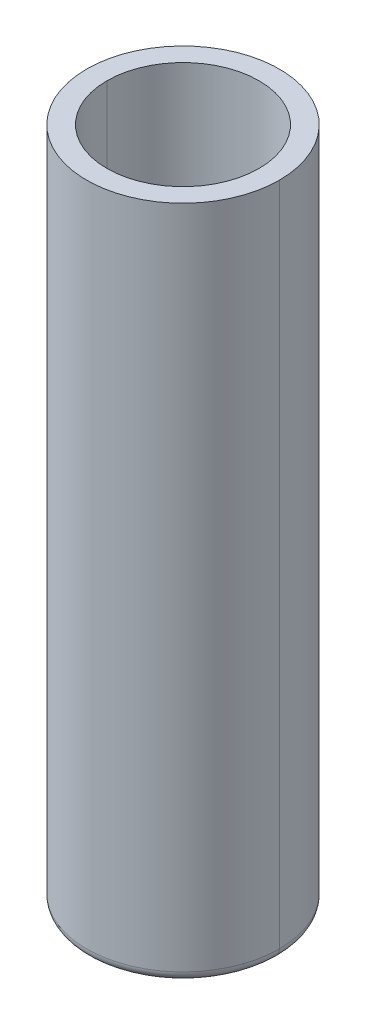
ISO-10303-21;
HEADER;
FILE_DESCRIPTION(('STEP AP214'),'2;1');
FILE_NAME('part.step','',(''),(''),'','','');
FILE_SCHEMA(('AUTOMOTIVE_DESIGN { 1 0 10303 214 1 1 1 1 }'));
ENDSEC;
DATA;
#1=APPLICATION_CONTEXT('core data for automotive mechanical design processes');
#2=APPLICATION_PROTOCOL_DEFINITION('international standard','automotive_design',2000,#1);
#3=PRODUCT_CONTEXT('',#1,'mechanical');
#4=PRODUCT('Part','Part','',(#3));
#5=PRODUCT_RELATED_PRODUCT_CATEGORY('part','',(#4));
#6=PRODUCT_DEFINITION_FORMATION('','',#4);
#7=PRODUCT_DEFINITION_CONTEXT('part definition',#1,'design');
#8=PRODUCT_DEFINITION('design','',#6,#7);
#9=PRODUCT_DEFINITION_SHAPE('','',#8);
#10=(LENGTH_UNIT() NAMED_UNIT(*) SI_UNIT(.MILLI.,.METRE.));
#11=(NAMED_UNIT(*) PLANE_ANGLE_UNIT() SI_UNIT($,.RADIAN.));
#12=(NAMED_UNIT(*) SI_UNIT($,.STERADIAN.) SOLID_ANGLE_UNIT());
#13=UNCERTAINTY_MEASURE_WITH_UNIT(LENGTH_MEASURE(1.E-05),#10,'distance_accuracy_value','');
#14=(GEOMETRIC_REPRESENTATION_CONTEXT(3) GLOBAL_UNCERTAINTY_ASSIGNED_CONTEXT((#13)) GLOBAL_UNIT_ASSIGNED_CONTEXT((#10,
#11,#12)) REPRESENTATION_CONTEXT('',''));
#15=CARTESIAN_POINT('',(0.,0.,0.));
#16=DIRECTION('',(0.,0.,1.));
#17=DIRECTION('',(1.,0.,0.));
#18=AXIS2_PLACEMENT_3D('',#15,#16,#17);
#19=CARTESIAN_POINT('',(0.,2.,0.));
#20=DIRECTION('',(0.,1.,0.));
#21=DIRECTION('',(1.,0.,0.));
#22=AXIS2_PLACEMENT_3D('',#19,#20,#21);
#23=PLANE('',#22);
#24=CARTESIAN_POINT('',(0.,2.,0.));
#25=DIRECTION('',(0.,1.,0.));
#26=DIRECTION('',(1.,0.,0.));
#27=AXIS2_PLACEMENT_3D('',#24,#25,#26);
#28=CIRCLE('',#27,2.25);
#29=CARTESIAN_POINT('',(-2.25,2.,0.));
#30=VERTEX_POINT('',#29);
#31=CARTESIAN_POINT('',(2.25,2.,0.));
#32=VERTEX_POINT('',#31);
#33=EDGE_CURVE('E29',#30,#32,#28,.T.);
#34=ORIENTED_EDGE('',*,*,#33,.T.);
#35=CARTESIAN_POINT('',(0.,2.,0.));
#36=DIRECTION('',(0.,1.,0.));
#37=DIRECTION('',(1.,0.,0.));
#38=AXIS2_PLACEMENT_3D('',#35,#36,#37);
#39=CIRCLE('',#38,2.25);
#40=EDGE_CURVE('E11',#32,#30,#39,.T.);
#41=ORIENTED_EDGE('',*,*,#40,.T.);
#42=EDGE_LOOP('',(#34,#41));
#43=FACE_BOUND('',#42,.T.);
#44=ADVANCED_FACE('F16',(#43),#23,.T.);
#45=CARTESIAN_POINT('',(0.,11.,0.));
#46=DIRECTION('',(0.,1.,0.));
#47=DIRECTION('',(-1.,0.,0.));
#48=AXIS2_PLACEMENT_3D('',#45,#46,#47);
#49=CYLINDRICAL_SURFACE('',#48,2.25);
#50=DIRECTION('',(0.,-1.,0.));
#51=VECTOR('',#50,1.);
#52=CARTESIAN_POINT('',(2.25,11.,0.));
#53=LINE('',#52,#51);
#54=CARTESIAN_POINT('',(2.25,20.,0.));
#55=VERTEX_POINT('',#54);
#56=EDGE_CURVE('E145',#55,#32,#53,.T.);
#57=ORIENTED_EDGE('',*,*,#56,.F.);
#58=CARTESIAN_POINT('',(0.,20.,0.));
#59=DIRECTION('',(0.,1.,0.));
#60=DIRECTION('',(1.,0.,0.));
#61=AXIS2_PLACEMENT_3D('',#58,#59,#60);
#62=CIRCLE('',#61,2.25);
#63=CARTESIAN_POINT('',(-2.25,20.,0.));
#64=VERTEX_POINT('',#63);
#65=EDGE_CURVE('E146',#55,#64,#62,.T.);
#66=ORIENTED_EDGE('',*,*,#65,.T.);
#67=DIRECTION('',(0.,-1.,0.));
#68=VECTOR('',#67,1.);
#69=CARTESIAN_POINT('',(-2.25,11.,0.));
#70=LINE('',#69,#68);
#71=EDGE_CURVE('E143',#64,#30,#70,.T.);
#72=ORIENTED_EDGE('',*,*,#71,.T.);
#73=ORIENTED_EDGE('',*,*,#40,.F.);
#74=EDGE_LOOP('',(#57,#66,#72,#73));
#75=FACE_BOUND('',#74,.T.);
#76=ADVANCED_FACE('F174',(#75),#49,.F.);
#77=CARTESIAN_POINT('',(0.,11.,0.));
#78=DIRECTION('',(0.,1.,0.));
#79=DIRECTION('',(-1.,0.,0.));
#80=AXIS2_PLACEMENT_3D('',#77,#78,#79);
#81=CYLINDRICAL_SURFACE('',#80,2.25);
#82=ORIENTED_EDGE('',*,*,#71,.F.);
#83=CARTESIAN_POINT('',(0.,20.,0.));
#84=DIRECTION('',(0.,1.,0.));
#85=DIRECTION('',(1.,0.,0.));
#86=AXIS2_PLACEMENT_3D('',#83,#84,#85);
#87=CIRCLE('',#86,2.25);
#88=EDGE_CURVE('E137',#64,#55,#87,.T.);
#89=ORIENTED_EDGE('',*,*,#88,.T.);
#90=ORIENTED_EDGE('',*,*,#56,.T.);
#91=ORIENTED_EDGE('',*,*,#33,.F.);
#92=EDGE_LOOP('',(#82,#89,#90,#91));
#93=FACE_BOUND('',#92,.T.);
#94=ADVANCED_FACE('F177',(#93),#81,.F.);
#95=CARTESIAN_POINT('',(0.,20.,0.));
#96=DIRECTION('',(0.,1.,0.));
#97=DIRECTION('',(1.,0.,0.));
#98=AXIS2_PLACEMENT_3D('',#95,#96,#97);
#99=PLANE('',#98);
#100=ORIENTED_EDGE('',*,*,#88,.F.);
#101=ORIENTED_EDGE('',*,*,#65,.F.);
#102=EDGE_LOOP('',(#100,#101));
#103=FACE_BOUND('',#102,.T.);
#104=CARTESIAN_POINT('',(0.,20.,0.));
#105=DIRECTION('',(0.,1.,0.));
#106=DIRECTION('',(1.,0.,0.));
#107=AXIS2_PLACEMENT_3D('',#104,#105,#106);
#108=CIRCLE('',#107,2.85);
#109=CARTESIAN_POINT('',(-2.85,20.,0.));
#110=VERTEX_POINT('',#109);
#111=CARTESIAN_POINT('',(2.85,20.,0.));
#112=VERTEX_POINT('',#111);
#113=EDGE_CURVE('E231',#110,#112,#108,.T.);
#114=ORIENTED_EDGE('',*,*,#113,.T.);
#115=CARTESIAN_POINT('',(0.,20.,0.));
#116=DIRECTION('',(0.,1.,0.));
#117=DIRECTION('',(1.,0.,0.));
#118=AXIS2_PLACEMENT_3D('',#115,#116,#117);
#119=CIRCLE('',#118,2.85);
#120=EDGE_CURVE('E217',#112,#110,#119,.T.);
#121=ORIENTED_EDGE('',*,*,#120,.T.);
#122=EDGE_LOOP('',(#114,#121));
#123=FACE_BOUND('',#122,.T.);
#124=ADVANCED_FACE('F165',(#103,#123),#99,.T.);
#125=CARTESIAN_POINT('',(0.,1.,0.));
#126=DIRECTION('',(0.,1.,0.));
#127=DIRECTION('',(0.127966679283979,0.,-0.991778467699834));
#128=AXIS2_PLACEMENT_3D('',#125,#126,#127);
#129=TOROIDAL_SURFACE('',#128,2.08591509775,1.);
#130=CARTESIAN_POINT('',(-1.00004096922,1.,-1.83056271537));
#131=DIRECTION('',(-0.877582561890372,0.,0.479425538604204));
#132=DIRECTION('',(0.479425538604204,0.,0.877582561890372));
#133=AXIS2_PLACEMENT_3D('',#130,#131,#132);
#134=CIRCLE('',#133,1.);
#135=CARTESIAN_POINT('',(-1.00004078601,0.,-1.83056281546));
#136=VERTEX_POINT('',#135);
#137=CARTESIAN_POINT('',(-0.646836361433,0.323807125575,-1.18402601756));
#138=VERTEX_POINT('',#137);
#139=EDGE_CURVE('E134',#136,#138,#134,.T.);
#140=ORIENTED_EDGE('',*,*,#139,.T.);
#141=CARTESIAN_POINT('',(0.,0.323807125575,0.));
#142=DIRECTION('',(0.,1.,0.));
#143=DIRECTION('',(1.,0.,0.));
#144=AXIS2_PLACEMENT_3D('',#141,#142,#143);
#145=CIRCLE('',#144,1.3491904568);
#146=CARTESIAN_POINT('',(0.646836361433,0.323807125575,1.18402601756));
#147=VERTEX_POINT('',#146);
#148=EDGE_CURVE('E249',#138,#147,#145,.T.);
#149=ORIENTED_EDGE('',*,*,#148,.T.);
#150=CARTESIAN_POINT('',(1.00004096922,1.,1.83056271537));
#151=DIRECTION('',(0.877582561890372,0.,-0.479425538604204));
#152=DIRECTION('',(0.479425538604204,0.,0.877582561890372));
#153=AXIS2_PLACEMENT_3D('',#150,#151,#152);
#154=CIRCLE('',#153,1.);
#155=CARTESIAN_POINT('',(1.00004096922,0.,1.83056271537));
#156=VERTEX_POINT('',#155);
#157=EDGE_CURVE('E138',#156,#147,#154,.T.);
#158=ORIENTED_EDGE('',*,*,#157,.F.);
#159=CARTESIAN_POINT('',(0.,0.,0.));
#160=DIRECTION('',(0.,1.,0.));
#161=DIRECTION('',(1.,0.,0.));
#162=AXIS2_PLACEMENT_3D('',#159,#160,#161);
#163=CIRCLE('',#162,2.08591509775);
#164=EDGE_CURVE('E110',#136,#156,#163,.T.);
#165=ORIENTED_EDGE('',*,*,#164,.F.);
#166=EDGE_LOOP('',(#140,#149,#158,#165));
#167=FACE_BOUND('',#166,.T.);
#168=ADVANCED_FACE('F162',(#167),#129,.T.);
#169=CARTESIAN_POINT('',(0.,1.,0.));
#170=DIRECTION('',(0.,1.,0.));
#171=DIRECTION('',(0.479425538604204,0.,0.877582561890372));
#172=AXIS2_PLACEMENT_3D('',#169,#170,#171);
#173=TOROIDAL_SURFACE('',#172,2.08591509775,1.);
#174=ORIENTED_EDGE('',*,*,#157,.T.);
#175=CARTESIAN_POINT('',(0.,0.323807125575,0.));
#176=DIRECTION('',(0.,1.,0.));
#177=DIRECTION('',(1.,0.,0.));
#178=AXIS2_PLACEMENT_3D('',#175,#176,#177);
#179=CIRCLE('',#178,1.3491904568);
#180=EDGE_CURVE('E104',#147,#138,#179,.T.);
#181=ORIENTED_EDGE('',*,*,#180,.T.);
#182=ORIENTED_EDGE('',*,*,#139,.F.);
#183=CARTESIAN_POINT('',(0.,0.,0.));
#184=DIRECTION('',(0.,1.,0.));
#185=DIRECTION('',(1.,0.,0.));
#186=AXIS2_PLACEMENT_3D('',#183,#184,#185);
#187=CIRCLE('',#186,2.08591509775);
#188=EDGE_CURVE('E116',#156,#136,#187,.T.);
#189=ORIENTED_EDGE('',*,*,#188,.F.);
#190=EDGE_LOOP('',(#174,#181,#182,#189));
#191=FACE_BOUND('',#190,.T.);
#192=ADVANCED_FACE('F155',(#191),#173,.T.);
#193=CARTESIAN_POINT('',(0.,0.323807125575,1.3491904568));
#194=CARTESIAN_POINT('',(0.,0.353262221282,1.32215549052));
#195=CARTESIAN_POINT('',(0.,0.381219804809,1.29383961818));
#196=CARTESIAN_POINT('',(0.,0.407679876157,1.2642428398));
#197=CARTESIAN_POINT('',(0.,0.488846989831,1.16384237585));
#198=CARTESIAN_POINT('',(0.,0.554181499343,1.04989939876));
#199=CARTESIAN_POINT('',(0.,0.591831059317,0.964505493118));
#200=CARTESIAN_POINT('',(0.,0.621888986932,0.8726180391));
#201=CARTESIAN_POINT('',(0.,0.644355282187,0.774237036705));
#202=(BOUNDED_CURVE() B_SPLINE_CURVE(5,(#193,#194,#195,#196,#197,#198,#199,#200,#201),
.UNSPECIFIED.,.F.,.F.) B_SPLINE_CURVE_WITH_KNOTS((6,3,6),(0.582420147271,0.789666510541,
1.2562929266),
.UNSPECIFIED.) CURVE() GEOMETRIC_REPRESENTATION_ITEM() RATIONAL_B_SPLINE_CURVE((1.,1.,1.,1.,1.,
1.,1.,1.,1.)) REPRESENTATION_ITEM(''));
#203=CARTESIAN_POINT('',(0.,0.218004316092,0.));
#204=DIRECTION('',(0.,-1.,0.));
#205=AXIS1_PLACEMENT('',#203,#204);
#206=SURFACE_OF_REVOLUTION('',#202,#205);
#207=CARTESIAN_POINT('',(-0.37118900833,0.644355282187,-0.679456922182));
#208=CARTESIAN_POINT('',(-0.418355373391,0.621888986932,-0.765794374305));
#209=CARTESIAN_POINT('',(-0.462408565525,0.591831059317,-0.846433201608));
#210=CARTESIAN_POINT('',(-0.50334858473,0.554181499343,-0.921373404089));
#211=CARTESIAN_POINT('',(-0.557975757895,0.488846989831,-1.02136777384));
#212=CARTESIAN_POINT('',(-0.606110304398,0.407679876157,-1.1094774702));
#213=CARTESIAN_POINT('',(-0.620299755814,0.381219804809,-1.1354510868));
#214=CARTESIAN_POINT('',(-0.633875108159,0.353262221282,-1.16030060258));
#215=CARTESIAN_POINT('',(-0.646836361433,0.323807125575,-1.18402601756));
#216=(BOUNDED_CURVE() B_SPLINE_CURVE(5,(#207,#208,#209,#210,#211,#212,#213,#214,#215),
.UNSPECIFIED.,.F.,.F.) B_SPLINE_CURVE_WITH_KNOTS((6,3,6),(-1.2562929266,-0.789666510541,
-0.582420147271),
.UNSPECIFIED.) CURVE() GEOMETRIC_REPRESENTATION_ITEM() RATIONAL_B_SPLINE_CURVE((1.,1.,1.,1.,1.,
1.,1.,1.,1.)) REPRESENTATION_ITEM(''));
#217=CARTESIAN_POINT('',(-0.37118900833,0.644355282187,-0.679456922182));
#218=VERTEX_POINT('',#217);
#219=EDGE_CURVE('E109',#218,#138,#216,.T.);
#220=ORIENTED_EDGE('',*,*,#219,.F.);
#221=CARTESIAN_POINT('',(0.,0.644355282187,0.));
#222=DIRECTION('',(0.,1.,0.));
#223=DIRECTION('',(1.,0.,0.));
#224=AXIS2_PLACEMENT_3D('',#221,#222,#223);
#225=CIRCLE('',#224,0.774237036705);
#226=CARTESIAN_POINT('',(0.37118900833,0.644355282187,0.679456922182));
#227=VERTEX_POINT('',#226);
#228=EDGE_CURVE('E114',#218,#227,#225,.T.);
#229=ORIENTED_EDGE('',*,*,#228,.T.);
#230=CARTESIAN_POINT('',(0.37118900833,0.644355282187,0.679456922182));
#231=CARTESIAN_POINT('',(0.418355373391,0.621888986932,0.765794374305));
#232=CARTESIAN_POINT('',(0.462408565525,0.591831059317,0.846433201608));
#233=CARTESIAN_POINT('',(0.50334858473,0.554181499343,0.921373404089));
#234=CARTESIAN_POINT('',(0.557975757895,0.488846989831,1.02136777384));
#235=CARTESIAN_POINT('',(0.606110304398,0.407679876157,1.1094774702));
#236=CARTESIAN_POINT('',(0.620299755814,0.381219804809,1.1354510868));
#237=CARTESIAN_POINT('',(0.633875108159,0.353262221282,1.16030060258));
#238=CARTESIAN_POINT('',(0.646836361433,0.323807125575,1.18402601756));
#239=(BOUNDED_CURVE() B_SPLINE_CURVE(5,(#230,#231,#232,#233,#234,#235,#236,#237,#238),
.UNSPECIFIED.,.F.,.F.) B_SPLINE_CURVE_WITH_KNOTS((6,3,6),(-1.2562929266,-0.789666510541,
-0.582420147271),
.UNSPECIFIED.) CURVE() GEOMETRIC_REPRESENTATION_ITEM() RATIONAL_B_SPLINE_CURVE((1.,1.,1.,1.,1.,
1.,1.,1.,1.)) REPRESENTATION_ITEM(''));
#240=EDGE_CURVE('E98',#227,#147,#239,.T.);
#241=ORIENTED_EDGE('',*,*,#240,.T.);
#242=ORIENTED_EDGE('',*,*,#148,.F.);
#243=EDGE_LOOP('',(#220,#229,#241,#242));
#244=FACE_BOUND('',#243,.T.);
#245=ADVANCED_FACE('F118',(#244),#206,.T.);
#246=CARTESIAN_POINT('',(0.,0.323807125575,1.3491904568));
#247=CARTESIAN_POINT('',(0.,0.353262221282,1.32215549052));
#248=CARTESIAN_POINT('',(0.,0.381219804809,1.29383961818));
#249=CARTESIAN_POINT('',(0.,0.407679876157,1.2642428398));
#250=CARTESIAN_POINT('',(0.,0.488846989831,1.16384237585));
#251=CARTESIAN_POINT('',(0.,0.554181499343,1.04989939876));
#252=CARTESIAN_POINT('',(0.,0.591831059317,0.964505493118));
#253=CARTESIAN_POINT('',(0.,0.621888986932,0.8726180391));
#254=CARTESIAN_POINT('',(0.,0.644355282187,0.774237036705));
#255=(BOUNDED_CURVE() B_SPLINE_CURVE(5,(#246,#247,#248,#249,#250,#251,#252,#253,#254),
.UNSPECIFIED.,.F.,.F.) B_SPLINE_CURVE_WITH_KNOTS((6,3,6),(0.582420147271,0.789666510541,
1.2562929266),
.UNSPECIFIED.) CURVE() GEOMETRIC_REPRESENTATION_ITEM() RATIONAL_B_SPLINE_CURVE((1.,1.,1.,1.,1.,
1.,1.,1.,1.)) REPRESENTATION_ITEM(''));
#256=CARTESIAN_POINT('',(0.,0.218004316092,0.));
#257=DIRECTION('',(0.,-1.,0.));
#258=AXIS1_PLACEMENT('',#256,#257);
#259=SURFACE_OF_REVOLUTION('',#255,#258);
#260=ORIENTED_EDGE('',*,*,#240,.F.);
#261=CARTESIAN_POINT('',(0.,0.644355282187,0.));
#262=DIRECTION('',(0.,1.,0.));
#263=DIRECTION('',(1.,0.,0.));
#264=AXIS2_PLACEMENT_3D('',#261,#262,#263);
#265=CIRCLE('',#264,0.774237036705);
#266=EDGE_CURVE('E101',#227,#218,#265,.T.);
#267=ORIENTED_EDGE('',*,*,#266,.T.);
#268=ORIENTED_EDGE('',*,*,#219,.T.);
#269=ORIENTED_EDGE('',*,*,#180,.F.);
#270=EDGE_LOOP('',(#260,#267,#268,#269));
#271=FACE_BOUND('',#270,.T.);
#272=ADVANCED_FACE('F18',(#271),#259,.T.);
#273=CARTESIAN_POINT('',(0.,0.,0.));
#274=DIRECTION('',(0.,1.,0.));
#275=DIRECTION('',(1.,0.,0.));
#276=AXIS2_PLACEMENT_3D('',#273,#274,#275);
#277=PLANE('',#276);
#278=ORIENTED_EDGE('',*,*,#188,.T.);
#279=ORIENTED_EDGE('',*,*,#164,.T.);
#280=EDGE_LOOP('',(#278,#279));
#281=FACE_BOUND('',#280,.T.);
#282=CARTESIAN_POINT('',(0.,0.,0.));
#283=DIRECTION('',(0.,1.,0.));
#284=DIRECTION('',(1.,0.,0.));
#285=AXIS2_PLACEMENT_3D('',#282,#283,#284);
#286=CIRCLE('',#285,2.55);
#287=CARTESIAN_POINT('',(-2.55,0.,0.));
#288=VERTEX_POINT('',#287);
#289=CARTESIAN_POINT('',(2.55,0.,0.));
#290=VERTEX_POINT('',#289);
#291=EDGE_CURVE('E120',#288,#290,#286,.T.);
#292=ORIENTED_EDGE('',*,*,#291,.F.);
#293=CARTESIAN_POINT('',(0.,0.,0.));
#294=DIRECTION('',(0.,1.,0.));
#295=DIRECTION('',(1.,0.,0.));
#296=AXIS2_PLACEMENT_3D('',#293,#294,#295);
#297=CIRCLE('',#296,2.55);
#298=EDGE_CURVE('E132',#290,#288,#297,.T.);
#299=ORIENTED_EDGE('',*,*,#298,.F.);
#300=EDGE_LOOP('',(#292,#299));
#301=FACE_BOUND('',#300,.T.);
#302=ADVANCED_FACE('F186',(#281,#301),#277,.F.);
#303=CARTESIAN_POINT('',(0.,0.644355282187,0.774237036705));
#304=DIRECTION('',(0.,1.,0.));
#305=DIRECTION('',(0.,0.,-1.));
#306=AXIS2_PLACEMENT_3D('',#303,#304,#305);
#307=PLANE('',#306);
#308=ORIENTED_EDGE('',*,*,#228,.F.);
#309=ORIENTED_EDGE('',*,*,#266,.F.);
#310=EDGE_LOOP('',(#308,#309));
#311=FACE_BOUND('',#310,.T.);
#312=ADVANCED_FACE('F113',(#311),#307,.F.);
#313=CARTESIAN_POINT('',(0.,0.3,0.));
#314=DIRECTION('',(0.,1.,0.));
#315=DIRECTION('',(-1.,0.,0.));
#316=AXIS2_PLACEMENT_3D('',#313,#314,#315);
#317=TOROIDAL_SURFACE('',#316,2.55,0.3);
#318=CARTESIAN_POINT('',(-2.55,0.3,0.));
#319=DIRECTION('',(0.,0.,1.));
#320=DIRECTION('',(1.,0.,0.));
#321=AXIS2_PLACEMENT_3D('',#318,#319,#320);
#322=CIRCLE('',#321,0.3);
#323=CARTESIAN_POINT('',(-2.85,0.3,0.));
#324=VERTEX_POINT('',#323);
#325=EDGE_CURVE('E125',#324,#288,#322,.T.);
#326=ORIENTED_EDGE('',*,*,#325,.T.);
#327=ORIENTED_EDGE('',*,*,#291,.T.);
#328=CARTESIAN_POINT('',(2.55,0.3,0.));
#329=DIRECTION('',(0.,0.,-1.));
#330=DIRECTION('',(1.,0.,0.));
#331=AXIS2_PLACEMENT_3D('',#328,#329,#330);
#332=CIRCLE('',#331,0.3);
#333=CARTESIAN_POINT('',(2.85,0.3,0.));
#334=VERTEX_POINT('',#333);
#335=EDGE_CURVE('E142',#334,#290,#332,.T.);
#336=ORIENTED_EDGE('',*,*,#335,.F.);
#337=CARTESIAN_POINT('',(0.,0.3,0.));
#338=DIRECTION('',(0.,1.,0.));
#339=DIRECTION('',(1.,0.,0.));
#340=AXIS2_PLACEMENT_3D('',#337,#338,#339);
#341=CIRCLE('',#340,2.85);
#342=EDGE_CURVE('E204',#324,#334,#341,.T.);
#343=ORIENTED_EDGE('',*,*,#342,.F.);
#344=EDGE_LOOP('',(#326,#327,#336,#343));
#345=FACE_BOUND('',#344,.T.);
#346=ADVANCED_FACE('F172',(#345),#317,.T.);
#347=CARTESIAN_POINT('',(0.,0.3,0.));
#348=DIRECTION('',(0.,1.,0.));
#349=DIRECTION('',(1.,0.,0.));
#350=AXIS2_PLACEMENT_3D('',#347,#348,#349);
#351=TOROIDAL_SURFACE('',#350,2.55,0.3);
#352=ORIENTED_EDGE('',*,*,#335,.T.);
#353=ORIENTED_EDGE('',*,*,#298,.T.);
#354=ORIENTED_EDGE('',*,*,#325,.F.);
#355=CARTESIAN_POINT('',(0.,0.3,0.));
#356=DIRECTION('',(0.,1.,0.));
#357=DIRECTION('',(1.,0.,0.));
#358=AXIS2_PLACEMENT_3D('',#355,#356,#357);
#359=CIRCLE('',#358,2.85);
#360=EDGE_CURVE('E210',#334,#324,#359,.T.);
#361=ORIENTED_EDGE('',*,*,#360,.F.);
#362=EDGE_LOOP('',(#352,#353,#354,#361));
#363=FACE_BOUND('',#362,.T.);
#364=ADVANCED_FACE('F160',(#363),#351,.T.);
#365=CARTESIAN_POINT('',(0.,10.,0.));
#366=DIRECTION('',(0.,1.,0.));
#367=DIRECTION('',(-1.,0.,0.));
#368=AXIS2_PLACEMENT_3D('',#365,#366,#367);
#369=CYLINDRICAL_SURFACE('',#368,2.85);
#370=DIRECTION('',(0.,1.,0.));
#371=VECTOR('',#370,1.);
#372=CARTESIAN_POINT('',(-2.85,10.,0.));
#373=LINE('',#372,#371);
#374=EDGE_CURVE('E221',#324,#110,#373,.T.);
#375=ORIENTED_EDGE('',*,*,#374,.T.);
#376=ORIENTED_EDGE('',*,*,#120,.F.);
#377=DIRECTION('',(0.,1.,0.));
#378=VECTOR('',#377,1.);
#379=CARTESIAN_POINT('',(2.85,10.,0.));
#380=LINE('',#379,#378);
#381=EDGE_CURVE('E237',#334,#112,#380,.T.);
#382=ORIENTED_EDGE('',*,*,#381,.F.);
#383=ORIENTED_EDGE('',*,*,#360,.T.);
#384=EDGE_LOOP('',(#375,#376,#382,#383));
#385=FACE_BOUND('',#384,.T.);
#386=ADVANCED_FACE('F156',(#385),#369,.T.);
#387=CARTESIAN_POINT('',(0.,10.,0.));
#388=DIRECTION('',(0.,1.,0.));
#389=DIRECTION('',(-1.,0.,0.));
#390=AXIS2_PLACEMENT_3D('',#387,#388,#389);
#391=CYLINDRICAL_SURFACE('',#390,2.85);
#392=ORIENTED_EDGE('',*,*,#381,.T.);
#393=ORIENTED_EDGE('',*,*,#113,.F.);
#394=ORIENTED_EDGE('',*,*,#374,.F.);
#395=ORIENTED_EDGE('',*,*,#342,.T.);
#396=EDGE_LOOP('',(#392,#393,#394,#395));
#397=FACE_BOUND('',#396,.T.);
#398=ADVANCED_FACE('F159',(#397),#391,.T.);
#399=CLOSED_SHELL('',(#44,#76,#94,#124,#168,#192,#245,#272,#302,#312,#346,#364,#386,#398));
#400=MANIFOLD_SOLID_BREP('B1',#399);
#401=ADVANCED_BREP_SHAPE_REPRESENTATION('',(#18,#400),#14);
#402=SHAPE_DEFINITION_REPRESENTATION(#9,#401);
ENDSEC;
END-ISO-10303-21;
